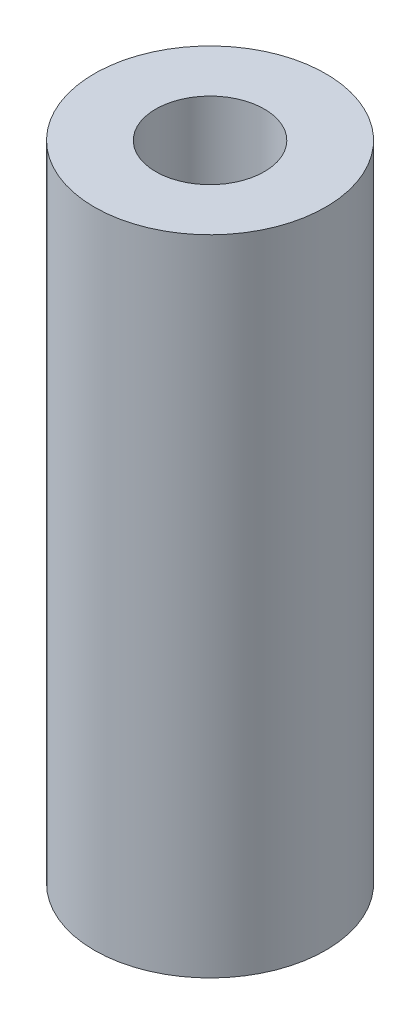
ISO-10303-21;
HEADER;
FILE_DESCRIPTION(('STEP AP214'),'2;1');
FILE_NAME('part.step','',(''),(''),'','','');
FILE_SCHEMA(('AUTOMOTIVE_DESIGN { 1 0 10303 214 1 1 1 1 }'));
ENDSEC;
DATA;
#1=APPLICATION_CONTEXT('core data for automotive mechanical design processes');
#2=APPLICATION_PROTOCOL_DEFINITION('international standard','automotive_design',2000,#1);
#3=PRODUCT_CONTEXT('',#1,'mechanical');
#4=PRODUCT('Part','Part','',(#3));
#5=PRODUCT_RELATED_PRODUCT_CATEGORY('part','',(#4));
#6=PRODUCT_DEFINITION_FORMATION('','',#4);
#7=PRODUCT_DEFINITION_CONTEXT('part definition',#1,'design');
#8=PRODUCT_DEFINITION('design','',#6,#7);
#9=PRODUCT_DEFINITION_SHAPE('','',#8);
#10=(LENGTH_UNIT() NAMED_UNIT(*) SI_UNIT(.MILLI.,.METRE.));
#11=(NAMED_UNIT(*) PLANE_ANGLE_UNIT() SI_UNIT($,.RADIAN.));
#12=(NAMED_UNIT(*) SI_UNIT($,.STERADIAN.) SOLID_ANGLE_UNIT());
#13=UNCERTAINTY_MEASURE_WITH_UNIT(LENGTH_MEASURE(1.E-05),#10,'distance_accuracy_value','');
#14=(GEOMETRIC_REPRESENTATION_CONTEXT(3) GLOBAL_UNCERTAINTY_ASSIGNED_CONTEXT((#13)) GLOBAL_UNIT_ASSIGNED_CONTEXT((#10,
#11,#12)) REPRESENTATION_CONTEXT('',''));
#15=CARTESIAN_POINT('',(0.,0.,0.));
#16=DIRECTION('',(0.,0.,1.));
#17=DIRECTION('',(1.,0.,0.));
#18=AXIS2_PLACEMENT_3D('',#15,#16,#17);
#19=CARTESIAN_POINT('',(0.,406.4,0.));
#20=DIRECTION('',(0.,1.,0.));
#21=DIRECTION('',(0.,0.,1.));
#22=AXIS2_PLACEMENT_3D('',#19,#20,#21);
#23=PLANE('',#22);
#24=CARTESIAN_POINT('',(0.,406.4,0.));
#25=DIRECTION('',(0.,1.,0.));
#26=DIRECTION('',(0.,0.,1.));
#27=AXIS2_PLACEMENT_3D('',#24,#25,#26);
#28=CIRCLE('',#27,73.025);
#29=CARTESIAN_POINT('',(0.,406.4,73.025));
#30=VERTEX_POINT('',#29);
#31=EDGE_CURVE('E10',#30,#30,#28,.T.);
#32=ORIENTED_EDGE('',*,*,#31,.T.);
#33=EDGE_LOOP('',(#32));
#34=FACE_BOUND('',#33,.T.);
#35=CARTESIAN_POINT('',(0.,406.4,0.));
#36=DIRECTION('',(0.,1.,0.));
#37=DIRECTION('',(0.,0.,1.));
#38=AXIS2_PLACEMENT_3D('',#35,#36,#37);
#39=CIRCLE('',#38,34.29);
#40=CARTESIAN_POINT('',(0.,406.4,34.29));
#41=VERTEX_POINT('',#40);
#42=EDGE_CURVE('E42',#41,#41,#39,.T.);
#43=ORIENTED_EDGE('',*,*,#42,.F.);
#44=EDGE_LOOP('',(#43));
#45=FACE_BOUND('',#44,.T.);
#46=ADVANCED_FACE('F31',(#34,#45),#23,.T.);
#47=CARTESIAN_POINT('',(0.,0.,0.));
#48=DIRECTION('',(0.,1.,0.));
#49=DIRECTION('',(0.,0.,1.));
#50=AXIS2_PLACEMENT_3D('',#47,#48,#49);
#51=PLANE('',#50);
#52=CARTESIAN_POINT('',(0.,0.,0.));
#53=DIRECTION('',(0.,1.,0.));
#54=DIRECTION('',(0.,0.,1.));
#55=AXIS2_PLACEMENT_3D('',#52,#53,#54);
#56=CIRCLE('',#55,73.025);
#57=CARTESIAN_POINT('',(0.,0.,73.025));
#58=VERTEX_POINT('',#57);
#59=EDGE_CURVE('E35',#58,#58,#56,.T.);
#60=ORIENTED_EDGE('',*,*,#59,.F.);
#61=EDGE_LOOP('',(#60));
#62=FACE_BOUND('',#61,.T.);
#63=CARTESIAN_POINT('',(0.,0.,0.));
#64=DIRECTION('',(0.,1.,0.));
#65=DIRECTION('',(0.,0.,1.));
#66=AXIS2_PLACEMENT_3D('',#63,#64,#65);
#67=CIRCLE('',#66,34.29);
#68=CARTESIAN_POINT('',(0.,0.,34.29));
#69=VERTEX_POINT('',#68);
#70=EDGE_CURVE('E44',#69,#69,#67,.T.);
#71=ORIENTED_EDGE('',*,*,#70,.T.);
#72=EDGE_LOOP('',(#71));
#73=FACE_BOUND('',#72,.T.);
#74=ADVANCED_FACE('F54',(#62,#73),#51,.F.);
#75=CARTESIAN_POINT('',(0.,406.4,0.));
#76=DIRECTION('',(0.,-1.,0.));
#77=DIRECTION('',(0.,0.,-1.));
#78=AXIS2_PLACEMENT_3D('',#75,#76,#77);
#79=CYLINDRICAL_SURFACE('',#78,73.025);
#80=ORIENTED_EDGE('',*,*,#31,.F.);
#81=EDGE_LOOP('',(#80));
#82=FACE_BOUND('',#81,.T.);
#83=ORIENTED_EDGE('',*,*,#59,.T.);
#84=EDGE_LOOP('',(#83));
#85=FACE_BOUND('',#84,.T.);
#86=ADVANCED_FACE('F33',(#82,#85),#79,.T.);
#87=CARTESIAN_POINT('',(0.,406.4,0.));
#88=DIRECTION('',(0.,-1.,0.));
#89=DIRECTION('',(0.,0.,-1.));
#90=AXIS2_PLACEMENT_3D('',#87,#88,#89);
#91=CYLINDRICAL_SURFACE('',#90,34.29);
#92=ORIENTED_EDGE('',*,*,#42,.T.);
#93=EDGE_LOOP('',(#92));
#94=FACE_BOUND('',#93,.T.);
#95=ORIENTED_EDGE('',*,*,#70,.F.);
#96=EDGE_LOOP('',(#95));
#97=FACE_BOUND('',#96,.T.);
#98=ADVANCED_FACE('F50',(#94,#97),#91,.F.);
#99=CLOSED_SHELL('',(#46,#74,#86,#98));
#100=MANIFOLD_SOLID_BREP('B2',#99);
#101=ADVANCED_BREP_SHAPE_REPRESENTATION('',(#18,#100),#14);
#102=SHAPE_DEFINITION_REPRESENTATION(#9,#101);
ENDSEC;
END-ISO-10303-21;
